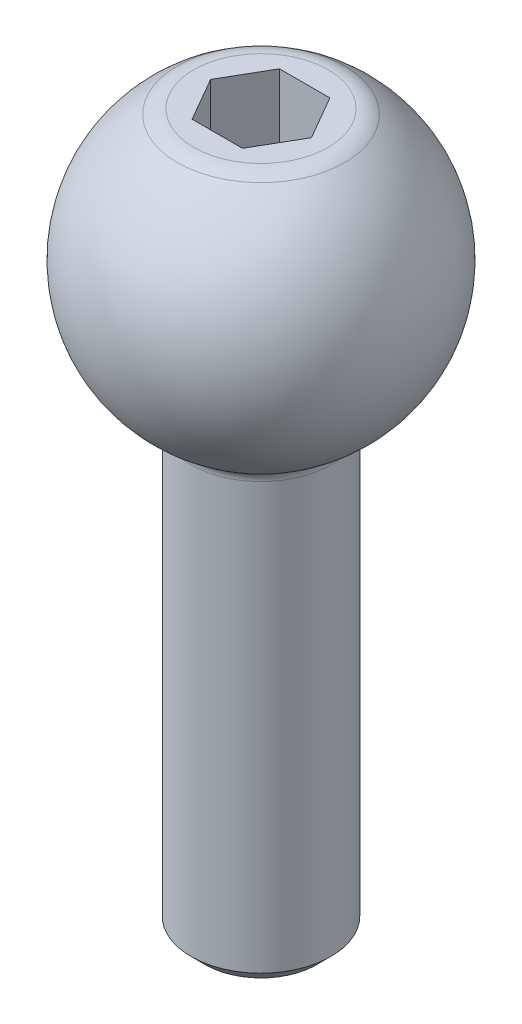
ISO-10303-21;
HEADER;
FILE_DESCRIPTION(('STEP AP214'),'2;1');
FILE_NAME('part.step','',(''),(''),'','','');
FILE_SCHEMA(('AUTOMOTIVE_DESIGN { 1 0 10303 214 1 1 1 1 }'));
ENDSEC;
DATA;
#1=APPLICATION_CONTEXT('core data for automotive mechanical design processes');
#2=APPLICATION_PROTOCOL_DEFINITION('international standard','automotive_design',2000,#1);
#3=PRODUCT_CONTEXT('',#1,'mechanical');
#4=PRODUCT('Part','Part','',(#3));
#5=PRODUCT_RELATED_PRODUCT_CATEGORY('part','',(#4));
#6=PRODUCT_DEFINITION_FORMATION('','',#4);
#7=PRODUCT_DEFINITION_CONTEXT('part definition',#1,'design');
#8=PRODUCT_DEFINITION('design','',#6,#7);
#9=PRODUCT_DEFINITION_SHAPE('','',#8);
#10=(LENGTH_UNIT() NAMED_UNIT(*) SI_UNIT(.MILLI.,.METRE.));
#11=(NAMED_UNIT(*) PLANE_ANGLE_UNIT() SI_UNIT($,.RADIAN.));
#12=(NAMED_UNIT(*) SI_UNIT($,.STERADIAN.) SOLID_ANGLE_UNIT());
#13=UNCERTAINTY_MEASURE_WITH_UNIT(LENGTH_MEASURE(1.E-05),#10,'distance_accuracy_value','');
#14=(GEOMETRIC_REPRESENTATION_CONTEXT(3) GLOBAL_UNCERTAINTY_ASSIGNED_CONTEXT((#13)) GLOBAL_UNIT_ASSIGNED_CONTEXT((#10,
#11,#12)) REPRESENTATION_CONTEXT('',''));
#15=CARTESIAN_POINT('',(0.,0.,0.));
#16=DIRECTION('',(0.,0.,1.));
#17=DIRECTION('',(1.,0.,0.));
#18=AXIS2_PLACEMENT_3D('',#15,#16,#17);
#19=CARTESIAN_POINT('',(0.,3.57451985412027,0.));
#20=DIRECTION('',(0.,1.,0.));
#21=DIRECTION('',(0.,0.,1.));
#22=AXIS2_PLACEMENT_3D('',#19,#20,#21);
#23=PLANE('',#22);
#24=DIRECTION('',(1.,0.,0.));
#25=VECTOR('',#24,1.);
#26=CARTESIAN_POINT('',(-0.687407664253899,3.57451985412027,1.190625));
#27=LINE('',#26,#25);
#28=CARTESIAN_POINT('',(-0.687407664253899,3.57451985412027,1.190625));
#29=VERTEX_POINT('',#28);
#30=CARTESIAN_POINT('',(0.687407664253899,3.57451985412027,1.190625));
#31=VERTEX_POINT('',#30);
#32=EDGE_CURVE('E67',#29,#31,#27,.T.);
#33=ORIENTED_EDGE('',*,*,#32,.F.);
#34=DIRECTION('',(0.5,0.,0.866025403784439));
#35=VECTOR('',#34,1.);
#36=CARTESIAN_POINT('',(-1.3748153285078,3.57451985412027,0.));
#37=LINE('',#36,#35);
#38=CARTESIAN_POINT('',(-1.3748153285078,3.57451985412027,0.));
#39=VERTEX_POINT('',#38);
#40=EDGE_CURVE('E150',#39,#29,#37,.T.);
#41=ORIENTED_EDGE('',*,*,#40,.F.);
#42=DIRECTION('',(-0.5,0.,0.866025403784438));
#43=VECTOR('',#42,1.);
#44=CARTESIAN_POINT('',(-0.687407664253897,3.57451985412027,-1.190625));
#45=LINE('',#44,#43);
#46=CARTESIAN_POINT('',(-0.687407664253897,3.57451985412027,-1.190625));
#47=VERTEX_POINT('',#46);
#48=EDGE_CURVE('E148',#47,#39,#45,.T.);
#49=ORIENTED_EDGE('',*,*,#48,.F.);
#50=DIRECTION('',(-1.,0.,0.));
#51=VECTOR('',#50,1.);
#52=CARTESIAN_POINT('',(0.687407664253899,3.57451985412027,-1.190625));
#53=LINE('',#52,#51);
#54=CARTESIAN_POINT('',(0.687407664253899,3.57451985412027,-1.190625));
#55=VERTEX_POINT('',#54);
#56=EDGE_CURVE('E115',#55,#47,#53,.T.);
#57=ORIENTED_EDGE('',*,*,#56,.F.);
#58=DIRECTION('',(-0.5,0.,-0.866025403784439));
#59=VECTOR('',#58,1.);
#60=CARTESIAN_POINT('',(1.3748153285078,3.57451985412027,0.));
#61=LINE('',#60,#59);
#62=CARTESIAN_POINT('',(1.3748153285078,3.57451985412027,0.));
#63=VERTEX_POINT('',#62);
#64=EDGE_CURVE('E144',#63,#55,#61,.T.);
#65=ORIENTED_EDGE('',*,*,#64,.F.);
#66=DIRECTION('',(0.5,0.,-0.866025403784439));
#67=VECTOR('',#66,1.);
#68=CARTESIAN_POINT('',(0.687407664253898,3.57451985412027,1.190625));
#69=LINE('',#68,#67);
#70=EDGE_CURVE('E141',#31,#63,#69,.T.);
#71=ORIENTED_EDGE('',*,*,#70,.F.);
#72=EDGE_LOOP('',(#33,#41,#49,#57,#65,#71));
#73=FACE_BOUND('',#72,.T.);
#74=CARTESIAN_POINT('',(0.,3.57451985412027,0.));
#75=DIRECTION('',(0.,1.,0.));
#76=DIRECTION('',(0.,0.,1.));
#77=AXIS2_PLACEMENT_3D('',#74,#75,#76);
#78=CIRCLE('',#77,1.83306833952199);
#79=CARTESIAN_POINT('',(0.,3.57451985412027,1.83306833952199));
#80=VERTEX_POINT('',#79);
#81=EDGE_CURVE('E60',#80,#80,#78,.T.);
#82=ORIENTED_EDGE('',*,*,#81,.T.);
#83=EDGE_LOOP('',(#82));
#84=FACE_BOUND('',#83,.T.);
#85=ADVANCED_FACE('F52',(#73,#84),#23,.T.);
#86=CARTESIAN_POINT('',(0.,0.,0.));
#87=DIRECTION('',(0.,-1.,0.));
#88=DIRECTION('',(-1.,0.,0.));
#89=AXIS2_PLACEMENT_3D('',#86,#87,#88);
#90=SPHERICAL_SURFACE('',#89,4.1275);
#91=CARTESIAN_POINT('',(0.,3.43892318999651,0.));
#92=DIRECTION('',(0.,-1.,0.));
#93=DIRECTION('',(0.,0.,-1.));
#94=AXIS2_PLACEMENT_3D('',#91,#92,#93);
#95=CIRCLE('',#94,2.28255636147375);
#96=CARTESIAN_POINT('',(-2.28255636147374,3.43892318999651,0.));
#97=VERTEX_POINT('',#96);
#98=EDGE_CURVE('E12',#97,#97,#95,.T.);
#99=CARTESIAN_POINT('',(0.,-3.55757974853397,0.));
#100=DIRECTION('',(0.,1.,0.));
#101=DIRECTION('',(-1.,0.,0.));
#102=AXIS2_PLACEMENT_3D('',#99,#100,#101);
#103=CIRCLE('',#102,2.09281690140848);
#104=CARTESIAN_POINT('',(-2.09281690140847,-3.55757974853397,0.));
#105=VERTEX_POINT('',#104);
#106=EDGE_CURVE('E165',#105,#105,#103,.T.);
#107=CARTESIAN_POINT('',(-2.28255636147374,3.43892318999651,0.));
#108=CARTESIAN_POINT('',(-2.35505798357408,3.39080558247677,0.));
#109=CARTESIAN_POINT('',(-2.4260332394035,3.34038911810698,0.));
#110=CARTESIAN_POINT('',(-2.56465769851458,3.23517389673687,0.));
#111=CARTESIAN_POINT('',(-2.63230690179625,3.18037513973656,0.));
#112=CARTESIAN_POINT('',(-2.7640059358059,3.06661075417502,0.));
#113=CARTESIAN_POINT('',(-2.82805576653389,3.00764512561378,0.));
#114=CARTESIAN_POINT('',(-2.95230069197059,2.88578377551208,0.));
#115=CARTESIAN_POINT('',(-3.01249578667929,2.82288805397161,0.));
#116=CARTESIAN_POINT('',(-3.12879033568443,2.6934177536557,0.));
#117=CARTESIAN_POINT('',(-3.18488978998085,2.62684317488026,0.));
#118=CARTESIAN_POINT('',(-3.29276878690032,2.49028144362942,0.));
#119=CARTESIAN_POINT('',(-3.34454832952335,2.42029429115402,0.));
#120=CARTESIAN_POINT('',(-3.4435804373418,2.27718725159393,0.));
#121=CARTESIAN_POINT('',(-3.49083300253722,2.20406736450925,0.));
#122=CARTESIAN_POINT('',(-3.58062221017666,2.05498724591567,0.));
#123=CARTESIAN_POINT('',(-3.6231588526207,1.97902701440679,0.));
#124=CARTESIAN_POINT('',(-3.70334612210896,1.82456994837222,0.));
#125=CARTESIAN_POINT('',(-3.74099674915318,1.74607311384653,0.));
#126=CARTESIAN_POINT('',(-3.8112614342607,1.58685672805804,0.));
#127=CARTESIAN_POINT('',(-3.84387549232399,1.50613717679523,0.));
#128=CARTESIAN_POINT('',(-3.90393662530327,1.34279813134152,0.));
#129=CARTESIAN_POINT('',(-3.93138370021926,1.26017863715062,0.));
#130=CARTESIAN_POINT('',(-3.98100111408863,1.0933700770913,0.));
#131=CARTESIAN_POINT('',(-4.00317145304201,1.0091810112229,0.));
#132=CARTESIAN_POINT('',(-4.04214674227123,0.839569955284405,0.));
#133=CARTESIAN_POINT('',(-4.05895169254708,0.754147965214321,0.));
#134=CARTESIAN_POINT('',(-4.08712900633524,0.582412638461008,0.));
#135=CARTESIAN_POINT('',(-4.09850136984755,0.496099301777781,0.));
#136=CARTESIAN_POINT('',(-4.1157680353484,0.32292642361906,0.));
#137=CARTESIAN_POINT('',(-4.12166233733695,0.236066882143567,0.));
#138=CARTESIAN_POINT('',(-4.12794931019846,0.0621489203352528,0.));
#139=CARTESIAN_POINT('',(-4.12834198107142,-0.0249094999975685,0.));
#140=CARTESIAN_POINT('',(-4.1236241215256,-0.198877098327304,0.));
#141=CARTESIAN_POINT('',(-4.11851359110681,-0.285786276324219,0.));
#142=CARTESIAN_POINT('',(-4.10280976449589,-0.459107865565415,0.));
#143=CARTESIAN_POINT('',(-4.09221646830376,-0.545520276809696,0.));
#144=CARTESIAN_POINT('',(-4.06558946964324,-0.717502794553873,0.));
#145=CARTESIAN_POINT('',(-4.04955576717485,-0.803072901053768,0.));
#146=CARTESIAN_POINT('',(-4.01211207005491,-0.97302863944872,0.));
#147=CARTESIAN_POINT('',(-3.99070207540336,-1.05741427134378,0.));
#148=CARTESIAN_POINT('',(-3.94259140623056,-1.22466362703407,0.));
#149=CARTESIAN_POINT('',(-3.91589073170931,-1.3075273508293,0.));
#150=CARTESIAN_POINT('',(-3.85730547100025,-1.47140154250022,0.));
#151=CARTESIAN_POINT('',(-3.82542088481244,-1.5524120103759,0.));
#152=CARTESIAN_POINT('',(-3.75659529789844,-1.71225575298232,0.));
#153=CARTESIAN_POINT('',(-3.71965429717224,-1.79108902771305,0.));
#154=CARTESIAN_POINT('',(-3.64086359752218,-1.94626315289333,0.));
#155=CARTESIAN_POINT('',(-3.59901389859832,-2.02260400334286,0.));
#156=CARTESIAN_POINT('',(-3.51057314701628,-2.17248801481706,0.));
#157=CARTESIAN_POINT('',(-3.46398209435811,-2.24603117584171,0.));
#158=CARTESIAN_POINT('',(-3.36624494028222,-2.39002573227195,0.));
#159=CARTESIAN_POINT('',(-3.31509883886451,-2.46047712767753,0.));
#160=CARTESIAN_POINT('',(-3.20845610199029,-2.5980064330004,0.));
#161=CARTESIAN_POINT('',(-3.15295946653378,-2.6650843429177,0.));
#162=CARTESIAN_POINT('',(-3.03783758984878,-2.7955984721417,0.));
#163=CARTESIAN_POINT('',(-2.9782123486203,-2.85903469144842,0.));
#164=CARTESIAN_POINT('',(-2.85507163418516,-2.98201170247325,0.));
#165=CARTESIAN_POINT('',(-2.7915561609785,-3.04155249419137,0.));
#166=CARTESIAN_POINT('',(-2.66088914949714,-3.15650084022519,0.));
#167=CARTESIAN_POINT('',(-2.59373761122244,-3.21190839454089,0.));
#168=CARTESIAN_POINT('',(-2.45606629077885,-3.31836767552939,0.));
#169=CARTESIAN_POINT('',(-2.38554650860995,-3.3694194022022,0.));
#170=CARTESIAN_POINT('',(-2.24142329415391,-3.46696673700259,0.));
#171=CARTESIAN_POINT('',(-2.16781986186677,-3.51346234513017,0.));
#172=CARTESIAN_POINT('',(-2.09281690140847,-3.55757974853397,0.));
#173=B_SPLINE_CURVE_WITH_KNOTS('',3,(#107,#108,#109,#110,#111,#112,#113,#114,#115,#116,#117,
#118,#119,#120,#121,#122,#123,#124,#125,#126,#127,#128,#129,#130,#131,#132,#133,#134,#135,#136,
#137,#138,#139,#140,#141,#142,#143,#144,#145,#146,#147,#148,#149,#150,#151,#152,#153,#154,#155,
#156,#157,#158,#159,#160,#161,#162,#163,#164,#165,#166,#167,#168,#169,#170,#171,#172),
.UNSPECIFIED.,.F.,.F.,(4,2,2,2,2,2,2,2,2,2,2,2,2,2,2,2,2,2,2,2,2,2,2,2,2,2,2,2,2,2,2,2,4),(0.,
0.261003855289274,0.522007710578546,0.78301156586782,1.04401542115709,1.30501927644637,
1.56602313173564,1.82702698702491,2.08803084231419,2.34903469760346,2.61003855289273,
2.87104240818201,3.13204626347128,3.39305011876056,3.65405397404983,3.9150578293391,
4.17606168462838,4.43706553991765,4.69806939520692,4.9590732504962,5.22007710578547,
5.48108096107474,5.74208481636402,6.00308867165329,6.26409252694256,6.52509638223184,
6.78610023752111,7.04710409281038,7.30810794809966,7.56911180338893,7.83011565867821,
8.09111951396748,8.35212336925675),.UNSPECIFIED.);
#174=EDGE_CURVE('BSEAM190',#97,#105,#173,.T.);
#175=ORIENTED_EDGE('',*,*,#98,.T.);
#176=ORIENTED_EDGE('',*,*,#106,.T.);
#177=ORIENTED_EDGE('',*,*,#174,.T.);
#178=ORIENTED_EDGE('',*,*,#174,.F.);
#179=EDGE_LOOP('',(#175,#177,#176,#178));
#180=FACE_BOUND('',#179,.T.);
#181=ADVANCED_FACE('F190',(#180),#90,.T.);
#182=CARTESIAN_POINT('',(3.69906595671313E-13,-107.836660193318,0.));
#183=DIRECTION('',(0.,-1.,0.));
#184=DIRECTION('',(1.,0.,0.));
#185=AXIS2_PLACEMENT_3D('',#182,#183,#184);
#186=CYLINDRICAL_SURFACE('',#185,1.90500000000003);
#187=CARTESIAN_POINT('',(0.,-15.494,0.));
#188=DIRECTION('',(0.,1.,0.));
#189=DIRECTION('',(-1.,0.,0.));
#190=AXIS2_PLACEMENT_3D('',#187,#188,#189);
#191=CIRCLE('',#190,1.90500000000003);
#192=CARTESIAN_POINT('',(-1.90499999999998,-15.494,0.));
#193=VERTEX_POINT('',#192);
#194=EDGE_CURVE('E154',#193,#193,#191,.T.);
#195=ORIENTED_EDGE('',*,*,#194,.T.);
#196=EDGE_LOOP('',(#195));
#197=FACE_BOUND('',#196,.T.);
#198=CARTESIAN_POINT('',(0.,-3.88597172532171,0.));
#199=DIRECTION('',(0.,1.,0.));
#200=DIRECTION('',(-1.,0.,0.));
#201=AXIS2_PLACEMENT_3D('',#198,#199,#200);
#202=CIRCLE('',#201,1.90500000000003);
#203=CARTESIAN_POINT('',(-1.90500000000002,-3.88597172532171,0.));
#204=VERTEX_POINT('',#203);
#205=EDGE_CURVE('E168',#204,#204,#202,.F.);
#206=ORIENTED_EDGE('',*,*,#205,.T.);
#207=EDGE_LOOP('',(#206));
#208=FACE_BOUND('',#207,.T.);
#209=ADVANCED_FACE('F194',(#197,#208),#186,.T.);
#210=CARTESIAN_POINT('',(0.,-15.875,0.));
#211=DIRECTION('',(0.,1.,0.));
#212=DIRECTION('',(-1.,0.,0.));
#213=AXIS2_PLACEMENT_3D('',#210,#211,#212);
#214=PLANE('',#213);
#215=CARTESIAN_POINT('',(0.,-15.875,0.));
#216=DIRECTION('',(0.,1.,0.));
#217=DIRECTION('',(-1.,0.,0.));
#218=AXIS2_PLACEMENT_3D('',#215,#216,#217);
#219=CIRCLE('',#218,1.52400000000004);
#220=CARTESIAN_POINT('',(-1.52399999999999,-15.875,0.));
#221=VERTEX_POINT('',#220);
#222=EDGE_CURVE('E162',#221,#221,#219,.F.);
#223=ORIENTED_EDGE('',*,*,#222,.T.);
#224=EDGE_LOOP('',(#223));
#225=FACE_BOUND('',#224,.T.);
#226=ADVANCED_FACE('F199',(#225),#214,.F.);
#227=CARTESIAN_POINT('',(0.,-3.88597172532172,0.));
#228=DIRECTION('',(0.,1.,0.));
#229=DIRECTION('',(-1.,0.,0.));
#230=AXIS2_PLACEMENT_3D('',#227,#228,#229);
#231=TOROIDAL_SURFACE('',#230,2.28600000000003,0.381);
#232=ORIENTED_EDGE('',*,*,#106,.F.);
#233=EDGE_LOOP('',(#232));
#234=FACE_BOUND('',#233,.T.);
#235=ORIENTED_EDGE('',*,*,#205,.F.);
#236=EDGE_LOOP('',(#235));
#237=FACE_BOUND('',#236,.T.);
#238=ADVANCED_FACE('F186',(#234,#237),#231,.F.);
#239=CARTESIAN_POINT('',(0.,-15.875,0.));
#240=DIRECTION('',(0.,1.,0.));
#241=DIRECTION('',(-1.,0.,0.));
#242=AXIS2_PLACEMENT_3D('',#239,#240,#241);
#243=CONICAL_SURFACE('',#242,1.52400000000004,0.785398163397447);
#244=ORIENTED_EDGE('',*,*,#194,.F.);
#245=EDGE_LOOP('',(#244));
#246=FACE_BOUND('',#245,.T.);
#247=ORIENTED_EDGE('',*,*,#222,.F.);
#248=EDGE_LOOP('',(#247));
#249=FACE_BOUND('',#248,.T.);
#250=ADVANCED_FACE('F176',(#246,#249),#243,.T.);
#251=CARTESIAN_POINT('',(0.,2.76171985412027,0.));
#252=DIRECTION('',(0.,1.,0.));
#253=DIRECTION('',(0.,0.,1.));
#254=AXIS2_PLACEMENT_3D('',#251,#252,#253);
#255=TOROIDAL_SURFACE('',#254,1.83306833952199,0.8128);
#256=ORIENTED_EDGE('',*,*,#98,.F.);
#257=EDGE_LOOP('',(#256));
#258=FACE_BOUND('',#257,.T.);
#259=ORIENTED_EDGE('',*,*,#81,.F.);
#260=EDGE_LOOP('',(#259));
#261=FACE_BOUND('',#260,.T.);
#262=ADVANCED_FACE('F54',(#258,#261),#255,.T.);
#263=CARTESIAN_POINT('',(-0.687407664253899,1.03451985412027,1.190625));
#264=DIRECTION('',(0.,0.,1.));
#265=DIRECTION('',(1.,0.,0.));
#266=AXIS2_PLACEMENT_3D('',#263,#264,#265);
#267=PLANE('',#266);
#268=ORIENTED_EDGE('',*,*,#32,.T.);
#269=DIRECTION('',(0.,1.,0.));
#270=VECTOR('',#269,1.);
#271=CARTESIAN_POINT('',(0.687407664253898,1.03451985412027,1.190625));
#272=LINE('',#271,#270);
#273=CARTESIAN_POINT('',(0.687407664253898,1.03451985412027,1.190625));
#274=VERTEX_POINT('',#273);
#275=EDGE_CURVE('E97',#274,#31,#272,.T.);
#276=ORIENTED_EDGE('',*,*,#275,.F.);
#277=DIRECTION('',(1.,0.,0.));
#278=VECTOR('',#277,1.);
#279=CARTESIAN_POINT('',(-0.687407664253899,1.03451985412027,1.190625));
#280=LINE('',#279,#278);
#281=CARTESIAN_POINT('',(-0.687407664253899,1.03451985412027,1.190625));
#282=VERTEX_POINT('',#281);
#283=EDGE_CURVE('E152',#282,#274,#280,.T.);
#284=ORIENTED_EDGE('',*,*,#283,.F.);
#285=DIRECTION('',(0.,1.,0.));
#286=VECTOR('',#285,1.);
#287=CARTESIAN_POINT('',(-0.687407664253899,1.03451985412027,1.190625));
#288=LINE('',#287,#286);
#289=EDGE_CURVE('E75',#282,#29,#288,.T.);
#290=ORIENTED_EDGE('',*,*,#289,.T.);
#291=EDGE_LOOP('',(#268,#276,#284,#290));
#292=FACE_BOUND('',#291,.T.);
#293=ADVANCED_FACE('F175',(#292),#267,.F.);
#294=CARTESIAN_POINT('',(-1.3748153285078,1.03451985412027,0.));
#295=DIRECTION('',(-0.866025403784439,0.,0.5));
#296=DIRECTION('',(0.5,0.,0.866025403784439));
#297=AXIS2_PLACEMENT_3D('',#294,#295,#296);
#298=PLANE('',#297);
#299=ORIENTED_EDGE('',*,*,#40,.T.);
#300=ORIENTED_EDGE('',*,*,#289,.F.);
#301=DIRECTION('',(0.5,0.,0.866025403784439));
#302=VECTOR('',#301,1.);
#303=CARTESIAN_POINT('',(-1.3748153285078,1.03451985412027,0.));
#304=LINE('',#303,#302);
#305=CARTESIAN_POINT('',(-1.3748153285078,1.03451985412027,0.));
#306=VERTEX_POINT('',#305);
#307=EDGE_CURVE('E127',#306,#282,#304,.T.);
#308=ORIENTED_EDGE('',*,*,#307,.F.);
#309=DIRECTION('',(0.,1.,0.));
#310=VECTOR('',#309,1.);
#311=CARTESIAN_POINT('',(-1.3748153285078,1.03451985412027,0.));
#312=LINE('',#311,#310);
#313=EDGE_CURVE('E119',#306,#39,#312,.T.);
#314=ORIENTED_EDGE('',*,*,#313,.T.);
#315=EDGE_LOOP('',(#299,#300,#308,#314));
#316=FACE_BOUND('',#315,.T.);
#317=ADVANCED_FACE('F183',(#316),#298,.F.);
#318=CARTESIAN_POINT('',(-0.687407664253897,1.03451985412027,-1.190625));
#319=DIRECTION('',(-0.866025403784438,0.,-0.5));
#320=DIRECTION('',(-0.5,0.,0.866025403784438));
#321=AXIS2_PLACEMENT_3D('',#318,#319,#320);
#322=PLANE('',#321);
#323=ORIENTED_EDGE('',*,*,#48,.T.);
#324=ORIENTED_EDGE('',*,*,#313,.F.);
#325=DIRECTION('',(-0.5,0.,0.866025403784438));
#326=VECTOR('',#325,1.);
#327=CARTESIAN_POINT('',(-0.687407664253897,1.03451985412027,-1.190625));
#328=LINE('',#327,#326);
#329=CARTESIAN_POINT('',(-0.687407664253897,1.03451985412027,-1.190625));
#330=VERTEX_POINT('',#329);
#331=EDGE_CURVE('E123',#330,#306,#328,.T.);
#332=ORIENTED_EDGE('',*,*,#331,.F.);
#333=DIRECTION('',(0.,1.,0.));
#334=VECTOR('',#333,1.);
#335=CARTESIAN_POINT('',(-0.687407664253897,1.03451985412027,-1.190625));
#336=LINE('',#335,#334);
#337=EDGE_CURVE('E108',#330,#47,#336,.T.);
#338=ORIENTED_EDGE('',*,*,#337,.T.);
#339=EDGE_LOOP('',(#323,#324,#332,#338));
#340=FACE_BOUND('',#339,.T.);
#341=ADVANCED_FACE('F124',(#340),#322,.F.);
#342=CARTESIAN_POINT('',(0.687407664253899,1.03451985412027,-1.190625));
#343=DIRECTION('',(0.,0.,-1.));
#344=DIRECTION('',(-1.,0.,0.));
#345=AXIS2_PLACEMENT_3D('',#342,#343,#344);
#346=PLANE('',#345);
#347=ORIENTED_EDGE('',*,*,#56,.T.);
#348=ORIENTED_EDGE('',*,*,#337,.F.);
#349=DIRECTION('',(-1.,0.,0.));
#350=VECTOR('',#349,1.);
#351=CARTESIAN_POINT('',(0.687407664253899,1.03451985412027,-1.190625));
#352=LINE('',#351,#350);
#353=CARTESIAN_POINT('',(0.687407664253899,1.03451985412027,-1.190625));
#354=VERTEX_POINT('',#353);
#355=EDGE_CURVE('E112',#354,#330,#352,.T.);
#356=ORIENTED_EDGE('',*,*,#355,.F.);
#357=DIRECTION('',(0.,1.,0.));
#358=VECTOR('',#357,1.);
#359=CARTESIAN_POINT('',(0.687407664253899,1.03451985412027,-1.190625));
#360=LINE('',#359,#358);
#361=EDGE_CURVE('E120',#354,#55,#360,.T.);
#362=ORIENTED_EDGE('',*,*,#361,.T.);
#363=EDGE_LOOP('',(#347,#348,#356,#362));
#364=FACE_BOUND('',#363,.T.);
#365=ADVANCED_FACE('F110',(#364),#346,.F.);
#366=CARTESIAN_POINT('',(1.3748153285078,1.03451985412027,0.));
#367=DIRECTION('',(0.866025403784439,0.,-0.5));
#368=DIRECTION('',(-0.5,0.,-0.866025403784439));
#369=AXIS2_PLACEMENT_3D('',#366,#367,#368);
#370=PLANE('',#369);
#371=ORIENTED_EDGE('',*,*,#64,.T.);
#372=ORIENTED_EDGE('',*,*,#361,.F.);
#373=DIRECTION('',(-0.5,0.,-0.866025403784439));
#374=VECTOR('',#373,1.);
#375=CARTESIAN_POINT('',(1.3748153285078,1.03451985412027,0.));
#376=LINE('',#375,#374);
#377=CARTESIAN_POINT('',(1.3748153285078,1.03451985412027,0.));
#378=VERTEX_POINT('',#377);
#379=EDGE_CURVE('E133',#378,#354,#376,.T.);
#380=ORIENTED_EDGE('',*,*,#379,.F.);
#381=DIRECTION('',(0.,1.,0.));
#382=VECTOR('',#381,1.);
#383=CARTESIAN_POINT('',(1.3748153285078,1.03451985412027,0.));
#384=LINE('',#383,#382);
#385=EDGE_CURVE('E157',#378,#63,#384,.T.);
#386=ORIENTED_EDGE('',*,*,#385,.T.);
#387=EDGE_LOOP('',(#371,#372,#380,#386));
#388=FACE_BOUND('',#387,.T.);
#389=ADVANCED_FACE('F216',(#388),#370,.F.);
#390=CARTESIAN_POINT('',(0.687407664253898,1.03451985412027,1.190625));
#391=DIRECTION('',(0.866025403784439,0.,0.5));
#392=DIRECTION('',(0.5,0.,-0.866025403784439));
#393=AXIS2_PLACEMENT_3D('',#390,#391,#392);
#394=PLANE('',#393);
#395=ORIENTED_EDGE('',*,*,#70,.T.);
#396=ORIENTED_EDGE('',*,*,#385,.F.);
#397=DIRECTION('',(0.5,0.,-0.866025403784439));
#398=VECTOR('',#397,1.);
#399=CARTESIAN_POINT('',(0.687407664253898,1.03451985412027,1.190625));
#400=LINE('',#399,#398);
#401=EDGE_CURVE('E135',#274,#378,#400,.T.);
#402=ORIENTED_EDGE('',*,*,#401,.F.);
#403=ORIENTED_EDGE('',*,*,#275,.T.);
#404=EDGE_LOOP('',(#395,#396,#402,#403));
#405=FACE_BOUND('',#404,.T.);
#406=ADVANCED_FACE('F213',(#405),#394,.F.);
#407=CARTESIAN_POINT('',(0.,1.03451985412027,0.));
#408=DIRECTION('',(0.,1.,0.));
#409=DIRECTION('',(0.,0.,1.));
#410=AXIS2_PLACEMENT_3D('',#407,#408,#409);
#411=PLANE('',#410);
#412=ORIENTED_EDGE('',*,*,#283,.T.);
#413=ORIENTED_EDGE('',*,*,#401,.T.);
#414=ORIENTED_EDGE('',*,*,#379,.T.);
#415=ORIENTED_EDGE('',*,*,#355,.T.);
#416=ORIENTED_EDGE('',*,*,#331,.T.);
#417=ORIENTED_EDGE('',*,*,#307,.T.);
#418=EDGE_LOOP('',(#412,#413,#414,#415,#416,#417));
#419=FACE_BOUND('',#418,.T.);
#420=ADVANCED_FACE('F130',(#419),#411,.T.);
#421=CLOSED_SHELL('',(#85,#181,#209,#226,#238,#250,#262,#293,#317,#341,#365,#389,#406,#420));
#422=MANIFOLD_SOLID_BREP('B2',#421);
#423=ADVANCED_BREP_SHAPE_REPRESENTATION('',(#18,#422),#14);
#424=SHAPE_DEFINITION_REPRESENTATION(#9,#423);
ENDSEC;
END-ISO-10303-21;
